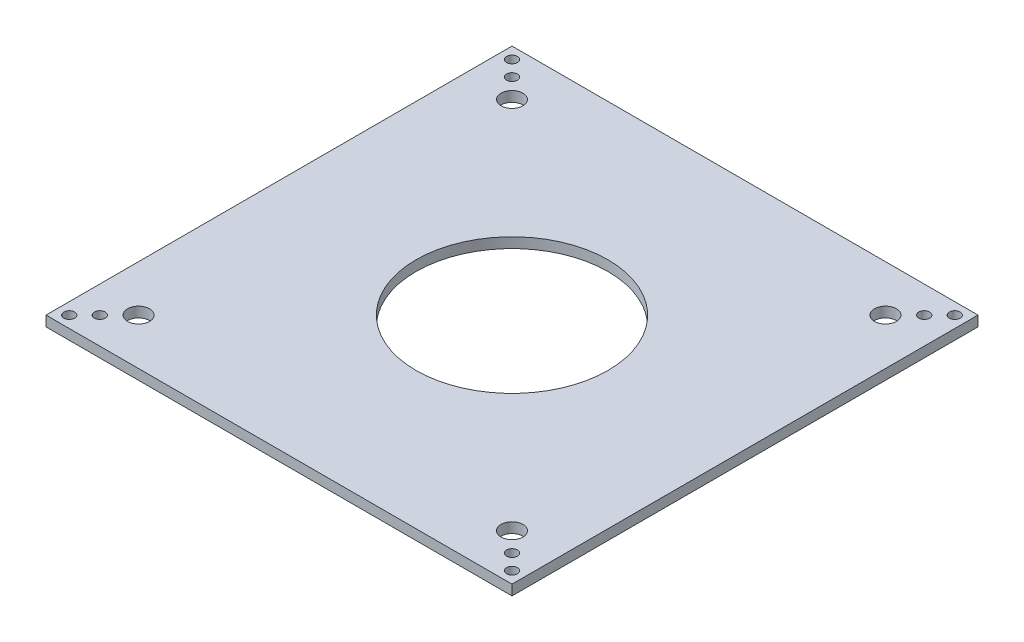
ISO-10303-21;
HEADER;
FILE_DESCRIPTION(('STEP AP214'),'2;1');
FILE_NAME('part.step','',(''),(''),'','','');
FILE_SCHEMA(('AUTOMOTIVE_DESIGN { 1 0 10303 214 1 1 1 1 }'));
ENDSEC;
DATA;
#1=APPLICATION_CONTEXT('core data for automotive mechanical design processes');
#2=APPLICATION_PROTOCOL_DEFINITION('international standard','automotive_design',2000,#1);
#3=PRODUCT_CONTEXT('',#1,'mechanical');
#4=PRODUCT('Part','Part','',(#3));
#5=PRODUCT_RELATED_PRODUCT_CATEGORY('part','',(#4));
#6=PRODUCT_DEFINITION_FORMATION('','',#4);
#7=PRODUCT_DEFINITION_CONTEXT('part definition',#1,'design');
#8=PRODUCT_DEFINITION('design','',#6,#7);
#9=PRODUCT_DEFINITION_SHAPE('','',#8);
#10=(LENGTH_UNIT() NAMED_UNIT(*) SI_UNIT(.MILLI.,.METRE.));
#11=(NAMED_UNIT(*) PLANE_ANGLE_UNIT() SI_UNIT($,.RADIAN.));
#12=(NAMED_UNIT(*) SI_UNIT($,.STERADIAN.) SOLID_ANGLE_UNIT());
#13=UNCERTAINTY_MEASURE_WITH_UNIT(LENGTH_MEASURE(1.E-05),#10,'distance_accuracy_value','');
#14=(GEOMETRIC_REPRESENTATION_CONTEXT(3) GLOBAL_UNCERTAINTY_ASSIGNED_CONTEXT((#13)) GLOBAL_UNIT_ASSIGNED_CONTEXT((#10,
#11,#12)) REPRESENTATION_CONTEXT('',''));
#15=CARTESIAN_POINT('',(0.,0.,0.));
#16=DIRECTION('',(0.,0.,1.));
#17=DIRECTION('',(1.,0.,0.));
#18=AXIS2_PLACEMENT_3D('',#15,#16,#17);
#19=CARTESIAN_POINT('',(0.,4.7498,0.));
#20=DIRECTION('',(0.,1.,0.));
#21=DIRECTION('',(0.,0.,1.));
#22=AXIS2_PLACEMENT_3D('',#19,#20,#21);
#23=PLANE('',#22);
#24=CARTESIAN_POINT('',(-86.5105223944239,4.7498,-86.5105223944239));
#25=DIRECTION('',(0.,1.,0.));
#26=DIRECTION('',(0.,0.,1.));
#27=AXIS2_PLACEMENT_3D('',#24,#25,#26);
#28=CIRCLE('',#27,5.08000000000002);
#29=CARTESIAN_POINT('',(-86.5105223944239,4.7498,-81.4305223944238));
#30=VERTEX_POINT('',#29);
#31=EDGE_CURVE('E179',#30,#30,#28,.T.);
#32=ORIENTED_EDGE('',*,*,#31,.F.);
#33=EDGE_LOOP('',(#32));
#34=FACE_BOUND('',#33,.T.);
#35=CARTESIAN_POINT('',(102.561846327358,4.7498,-102.561846327359));
#36=DIRECTION('',(0.,1.,0.));
#37=DIRECTION('',(0.,0.,1.));
#38=AXIS2_PLACEMENT_3D('',#35,#36,#37);
#39=CIRCLE('',#38,2.50000000000001);
#40=CARTESIAN_POINT('',(102.561846327358,4.7498,-100.061846327359));
#41=VERTEX_POINT('',#40);
#42=EDGE_CURVE('E167',#41,#41,#39,.T.);
#43=ORIENTED_EDGE('',*,*,#42,.F.);
#44=EDGE_LOOP('',(#43));
#45=FACE_BOUND('',#44,.T.);
#46=CARTESIAN_POINT('',(-102.561846327359,4.7498,-102.561846327358));
#47=DIRECTION('',(0.,1.,0.));
#48=DIRECTION('',(0.,0.,1.));
#49=AXIS2_PLACEMENT_3D('',#46,#47,#48);
#50=CIRCLE('',#49,2.5);
#51=CARTESIAN_POINT('',(-102.561846327359,4.7498,-100.061846327358));
#52=VERTEX_POINT('',#51);
#53=EDGE_CURVE('E155',#52,#52,#50,.T.);
#54=ORIENTED_EDGE('',*,*,#53,.F.);
#55=EDGE_LOOP('',(#54));
#56=FACE_BOUND('',#55,.T.);
#57=CARTESIAN_POINT('',(-102.561846327358,4.7498,102.561846327359));
#58=DIRECTION('',(0.,1.,0.));
#59=DIRECTION('',(0.,0.,1.));
#60=AXIS2_PLACEMENT_3D('',#57,#58,#59);
#61=CIRCLE('',#60,2.5);
#62=CARTESIAN_POINT('',(-102.561846327358,4.7498,105.061846327359));
#63=VERTEX_POINT('',#62);
#64=EDGE_CURVE('E143',#63,#63,#61,.T.);
#65=ORIENTED_EDGE('',*,*,#64,.F.);
#66=EDGE_LOOP('',(#65));
#67=FACE_BOUND('',#66,.T.);
#68=CARTESIAN_POINT('',(86.5105223944239,4.7498,86.5105223944239));
#69=DIRECTION('',(0.,1.,0.));
#70=DIRECTION('',(0.,0.,1.));
#71=AXIS2_PLACEMENT_3D('',#68,#69,#70);
#72=CIRCLE('',#71,5.08000000000001);
#73=CARTESIAN_POINT('',(86.5105223944239,4.7498,91.5905223944239));
#74=VERTEX_POINT('',#73);
#75=EDGE_CURVE('E131',#74,#74,#72,.T.);
#76=ORIENTED_EDGE('',*,*,#75,.F.);
#77=EDGE_LOOP('',(#76));
#78=FACE_BOUND('',#77,.T.);
#79=CARTESIAN_POINT('',(102.561846327359,4.7498,102.561846327358));
#80=DIRECTION('',(0.,1.,0.));
#81=DIRECTION('',(0.,0.,1.));
#82=AXIS2_PLACEMENT_3D('',#79,#80,#81);
#83=CIRCLE('',#82,2.50000000000001);
#84=CARTESIAN_POINT('',(102.561846327359,4.7498,105.061846327358));
#85=VERTEX_POINT('',#84);
#86=EDGE_CURVE('E119',#85,#85,#83,.T.);
#87=ORIENTED_EDGE('',*,*,#86,.F.);
#88=EDGE_LOOP('',(#87));
#89=FACE_BOUND('',#88,.T.);
#90=DIRECTION('',(0.,0.,1.));
#91=VECTOR('',#90,1.);
#92=CARTESIAN_POINT('',(-107.95,4.7498,-107.95));
#93=LINE('',#92,#91);
#94=CARTESIAN_POINT('',(-107.95,4.7498,-107.95));
#95=VERTEX_POINT('',#94);
#96=CARTESIAN_POINT('',(-107.95,4.7498,107.95));
#97=VERTEX_POINT('',#96);
#98=EDGE_CURVE('E89',#95,#97,#93,.T.);
#99=ORIENTED_EDGE('',*,*,#98,.T.);
#100=DIRECTION('',(1.,0.,0.));
#101=VECTOR('',#100,1.);
#102=CARTESIAN_POINT('',(-107.95,4.7498,107.95));
#103=LINE('',#102,#101);
#104=CARTESIAN_POINT('',(107.95,4.7498,107.95));
#105=VERTEX_POINT('',#104);
#106=EDGE_CURVE('E84',#97,#105,#103,.T.);
#107=ORIENTED_EDGE('',*,*,#106,.T.);
#108=DIRECTION('',(0.,0.,-1.));
#109=VECTOR('',#108,1.);
#110=CARTESIAN_POINT('',(107.95,4.7498,-107.95));
#111=LINE('',#110,#109);
#112=CARTESIAN_POINT('',(107.95,4.7498,-107.95));
#113=VERTEX_POINT('',#112);
#114=EDGE_CURVE('E87',#105,#113,#111,.T.);
#115=ORIENTED_EDGE('',*,*,#114,.T.);
#116=DIRECTION('',(-1.,0.,0.));
#117=VECTOR('',#116,1.);
#118=CARTESIAN_POINT('',(-107.95,4.7498,-107.95));
#119=LINE('',#118,#117);
#120=EDGE_CURVE('E54',#113,#95,#119,.T.);
#121=ORIENTED_EDGE('',*,*,#120,.T.);
#122=EDGE_LOOP('',(#99,#107,#115,#121));
#123=FACE_BOUND('',#122,.T.);
#124=CARTESIAN_POINT('',(95.490778515493,4.7498,95.490778515493));
#125=DIRECTION('',(0.,1.,0.));
#126=DIRECTION('',(0.,0.,1.));
#127=AXIS2_PLACEMENT_3D('',#124,#125,#126);
#128=CIRCLE('',#127,2.50000000000001);
#129=CARTESIAN_POINT('',(95.490778515493,4.7498,97.990778515493));
#130=VERTEX_POINT('',#129);
#131=EDGE_CURVE('E104',#130,#130,#128,.T.);
#132=ORIENTED_EDGE('',*,*,#131,.F.);
#133=EDGE_LOOP('',(#132));
#134=FACE_BOUND('',#133,.T.);
#135=CARTESIAN_POINT('',(0.,4.7498,0.));
#136=DIRECTION('',(0.,1.,0.));
#137=DIRECTION('',(0.,0.,1.));
#138=AXIS2_PLACEMENT_3D('',#135,#136,#137);
#139=CIRCLE('',#138,44.45);
#140=CARTESIAN_POINT('',(0.,4.7498,44.45));
#141=VERTEX_POINT('',#140);
#142=EDGE_CURVE('E125',#141,#141,#139,.T.);
#143=ORIENTED_EDGE('',*,*,#142,.F.);
#144=EDGE_LOOP('',(#143));
#145=FACE_BOUND('',#144,.T.);
#146=CARTESIAN_POINT('',(-95.490778515493,4.7498,95.490778515493));
#147=DIRECTION('',(0.,1.,0.));
#148=DIRECTION('',(0.,0.,1.));
#149=AXIS2_PLACEMENT_3D('',#146,#147,#148);
#150=CIRCLE('',#149,2.5);
#151=CARTESIAN_POINT('',(-95.490778515493,4.7498,97.990778515493));
#152=VERTEX_POINT('',#151);
#153=EDGE_CURVE('E137',#152,#152,#150,.T.);
#154=ORIENTED_EDGE('',*,*,#153,.F.);
#155=EDGE_LOOP('',(#154));
#156=FACE_BOUND('',#155,.T.);
#157=CARTESIAN_POINT('',(-95.4907785154931,4.7498,-95.490778515493));
#158=DIRECTION('',(0.,1.,0.));
#159=DIRECTION('',(0.,0.,1.));
#160=AXIS2_PLACEMENT_3D('',#157,#158,#159);
#161=CIRCLE('',#160,2.5);
#162=CARTESIAN_POINT('',(-95.4907785154931,4.7498,-92.990778515493));
#163=VERTEX_POINT('',#162);
#164=EDGE_CURVE('E149',#163,#163,#161,.T.);
#165=ORIENTED_EDGE('',*,*,#164,.F.);
#166=EDGE_LOOP('',(#165));
#167=FACE_BOUND('',#166,.T.);
#168=CARTESIAN_POINT('',(95.490778515493,4.7498,-95.490778515493));
#169=DIRECTION('',(0.,1.,0.));
#170=DIRECTION('',(0.,0.,1.));
#171=AXIS2_PLACEMENT_3D('',#168,#169,#170);
#172=CIRCLE('',#171,2.50000000000001);
#173=CARTESIAN_POINT('',(95.490778515493,4.7498,-92.990778515493));
#174=VERTEX_POINT('',#173);
#175=EDGE_CURVE('E161',#174,#174,#172,.T.);
#176=ORIENTED_EDGE('',*,*,#175,.F.);
#177=EDGE_LOOP('',(#176));
#178=FACE_BOUND('',#177,.T.);
#179=CARTESIAN_POINT('',(-86.5105223944239,4.7498,86.5105223944239));
#180=DIRECTION('',(0.,1.,0.));
#181=DIRECTION('',(0.,0.,1.));
#182=AXIS2_PLACEMENT_3D('',#179,#180,#181);
#183=CIRCLE('',#182,5.08000000000002);
#184=CARTESIAN_POINT('',(-86.5105223944239,4.7498,91.5905223944239));
#185=VERTEX_POINT('',#184);
#186=EDGE_CURVE('E173',#185,#185,#183,.T.);
#187=ORIENTED_EDGE('',*,*,#186,.F.);
#188=EDGE_LOOP('',(#187));
#189=FACE_BOUND('',#188,.T.);
#190=CARTESIAN_POINT('',(86.5105223944239,4.7498,-86.5105223944239));
#191=DIRECTION('',(0.,1.,0.));
#192=DIRECTION('',(0.,0.,1.));
#193=AXIS2_PLACEMENT_3D('',#190,#191,#192);
#194=CIRCLE('',#193,5.08000000000001);
#195=CARTESIAN_POINT('',(86.5105223944239,4.7498,-81.4305223944239));
#196=VERTEX_POINT('',#195);
#197=EDGE_CURVE('E185',#196,#196,#194,.T.);
#198=ORIENTED_EDGE('',*,*,#197,.F.);
#199=EDGE_LOOP('',(#198));
#200=FACE_BOUND('',#199,.T.);
#201=ADVANCED_FACE('F37',(#34,#45,#56,#67,#78,#89,#123,#134,#145,#156,#167,#178,#189,#200),#23,.T.);
#202=CARTESIAN_POINT('',(0.,0.,0.));
#203=DIRECTION('',(0.,1.,0.));
#204=DIRECTION('',(0.,0.,1.));
#205=AXIS2_PLACEMENT_3D('',#202,#203,#204);
#206=PLANE('',#205);
#207=DIRECTION('',(0.,0.,1.));
#208=VECTOR('',#207,1.);
#209=CARTESIAN_POINT('',(-107.95,0.,-107.95));
#210=LINE('',#209,#208);
#211=CARTESIAN_POINT('',(-107.95,0.,-107.95));
#212=VERTEX_POINT('',#211);
#213=CARTESIAN_POINT('',(-107.95,0.,107.95));
#214=VERTEX_POINT('',#213);
#215=EDGE_CURVE('E101',#212,#214,#210,.T.);
#216=ORIENTED_EDGE('',*,*,#215,.F.);
#217=DIRECTION('',(-1.,0.,0.));
#218=VECTOR('',#217,1.);
#219=CARTESIAN_POINT('',(-107.95,0.,-107.95));
#220=LINE('',#219,#218);
#221=CARTESIAN_POINT('',(107.95,0.,-107.95));
#222=VERTEX_POINT('',#221);
#223=EDGE_CURVE('E77',#222,#212,#220,.T.);
#224=ORIENTED_EDGE('',*,*,#223,.F.);
#225=DIRECTION('',(0.,0.,-1.));
#226=VECTOR('',#225,1.);
#227=CARTESIAN_POINT('',(107.95,0.,-107.95));
#228=LINE('',#227,#226);
#229=CARTESIAN_POINT('',(107.95,0.,107.95));
#230=VERTEX_POINT('',#229);
#231=EDGE_CURVE('E71',#230,#222,#228,.T.);
#232=ORIENTED_EDGE('',*,*,#231,.F.);
#233=DIRECTION('',(1.,0.,0.));
#234=VECTOR('',#233,1.);
#235=CARTESIAN_POINT('',(-107.95,0.,107.95));
#236=LINE('',#235,#234);
#237=EDGE_CURVE('E93',#214,#230,#236,.T.);
#238=ORIENTED_EDGE('',*,*,#237,.F.);
#239=EDGE_LOOP('',(#216,#224,#232,#238));
#240=FACE_BOUND('',#239,.T.);
#241=CARTESIAN_POINT('',(95.490778515493,0.,95.490778515493));
#242=DIRECTION('',(0.,1.,0.));
#243=DIRECTION('',(0.,0.,1.));
#244=AXIS2_PLACEMENT_3D('',#241,#242,#243);
#245=CIRCLE('',#244,2.50000000000001);
#246=CARTESIAN_POINT('',(95.490778515493,0.,97.990778515493));
#247=VERTEX_POINT('',#246);
#248=EDGE_CURVE('E116',#247,#247,#245,.T.);
#249=ORIENTED_EDGE('',*,*,#248,.T.);
#250=EDGE_LOOP('',(#249));
#251=FACE_BOUND('',#250,.T.);
#252=CARTESIAN_POINT('',(102.561846327359,0.,102.561846327358));
#253=DIRECTION('',(0.,1.,0.));
#254=DIRECTION('',(0.,0.,1.));
#255=AXIS2_PLACEMENT_3D('',#252,#253,#254);
#256=CIRCLE('',#255,2.50000000000001);
#257=CARTESIAN_POINT('',(102.561846327359,0.,105.061846327358));
#258=VERTEX_POINT('',#257);
#259=EDGE_CURVE('E122',#258,#258,#256,.T.);
#260=ORIENTED_EDGE('',*,*,#259,.T.);
#261=EDGE_LOOP('',(#260));
#262=FACE_BOUND('',#261,.T.);
#263=CARTESIAN_POINT('',(0.,0.,0.));
#264=DIRECTION('',(0.,1.,0.));
#265=DIRECTION('',(0.,0.,1.));
#266=AXIS2_PLACEMENT_3D('',#263,#264,#265);
#267=CIRCLE('',#266,44.45);
#268=CARTESIAN_POINT('',(0.,0.,44.45));
#269=VERTEX_POINT('',#268);
#270=EDGE_CURVE('E128',#269,#269,#267,.T.);
#271=ORIENTED_EDGE('',*,*,#270,.T.);
#272=EDGE_LOOP('',(#271));
#273=FACE_BOUND('',#272,.T.);
#274=CARTESIAN_POINT('',(86.5105223944239,0.,86.5105223944239));
#275=DIRECTION('',(0.,1.,0.));
#276=DIRECTION('',(0.,0.,1.));
#277=AXIS2_PLACEMENT_3D('',#274,#275,#276);
#278=CIRCLE('',#277,5.08000000000001);
#279=CARTESIAN_POINT('',(86.5105223944239,0.,91.5905223944239));
#280=VERTEX_POINT('',#279);
#281=EDGE_CURVE('E134',#280,#280,#278,.T.);
#282=ORIENTED_EDGE('',*,*,#281,.T.);
#283=EDGE_LOOP('',(#282));
#284=FACE_BOUND('',#283,.T.);
#285=CARTESIAN_POINT('',(-95.490778515493,0.,95.490778515493));
#286=DIRECTION('',(0.,1.,0.));
#287=DIRECTION('',(0.,0.,1.));
#288=AXIS2_PLACEMENT_3D('',#285,#286,#287);
#289=CIRCLE('',#288,2.5);
#290=CARTESIAN_POINT('',(-95.490778515493,0.,97.990778515493));
#291=VERTEX_POINT('',#290);
#292=EDGE_CURVE('E140',#291,#291,#289,.T.);
#293=ORIENTED_EDGE('',*,*,#292,.T.);
#294=EDGE_LOOP('',(#293));
#295=FACE_BOUND('',#294,.T.);
#296=CARTESIAN_POINT('',(-102.561846327358,0.,102.561846327359));
#297=DIRECTION('',(0.,1.,0.));
#298=DIRECTION('',(0.,0.,1.));
#299=AXIS2_PLACEMENT_3D('',#296,#297,#298);
#300=CIRCLE('',#299,2.5);
#301=CARTESIAN_POINT('',(-102.561846327358,0.,105.061846327359));
#302=VERTEX_POINT('',#301);
#303=EDGE_CURVE('E146',#302,#302,#300,.T.);
#304=ORIENTED_EDGE('',*,*,#303,.T.);
#305=EDGE_LOOP('',(#304));
#306=FACE_BOUND('',#305,.T.);
#307=CARTESIAN_POINT('',(-95.4907785154931,0.,-95.490778515493));
#308=DIRECTION('',(0.,1.,0.));
#309=DIRECTION('',(0.,0.,1.));
#310=AXIS2_PLACEMENT_3D('',#307,#308,#309);
#311=CIRCLE('',#310,2.5);
#312=CARTESIAN_POINT('',(-95.4907785154931,0.,-92.990778515493));
#313=VERTEX_POINT('',#312);
#314=EDGE_CURVE('E152',#313,#313,#311,.T.);
#315=ORIENTED_EDGE('',*,*,#314,.T.);
#316=EDGE_LOOP('',(#315));
#317=FACE_BOUND('',#316,.T.);
#318=CARTESIAN_POINT('',(-102.561846327359,0.,-102.561846327358));
#319=DIRECTION('',(0.,1.,0.));
#320=DIRECTION('',(0.,0.,1.));
#321=AXIS2_PLACEMENT_3D('',#318,#319,#320);
#322=CIRCLE('',#321,2.5);
#323=CARTESIAN_POINT('',(-102.561846327359,0.,-100.061846327358));
#324=VERTEX_POINT('',#323);
#325=EDGE_CURVE('E158',#324,#324,#322,.T.);
#326=ORIENTED_EDGE('',*,*,#325,.T.);
#327=EDGE_LOOP('',(#326));
#328=FACE_BOUND('',#327,.T.);
#329=CARTESIAN_POINT('',(95.490778515493,0.,-95.490778515493));
#330=DIRECTION('',(0.,1.,0.));
#331=DIRECTION('',(0.,0.,1.));
#332=AXIS2_PLACEMENT_3D('',#329,#330,#331);
#333=CIRCLE('',#332,2.50000000000001);
#334=CARTESIAN_POINT('',(95.490778515493,0.,-92.990778515493));
#335=VERTEX_POINT('',#334);
#336=EDGE_CURVE('E164',#335,#335,#333,.T.);
#337=ORIENTED_EDGE('',*,*,#336,.T.);
#338=EDGE_LOOP('',(#337));
#339=FACE_BOUND('',#338,.T.);
#340=CARTESIAN_POINT('',(102.561846327358,0.,-102.561846327359));
#341=DIRECTION('',(0.,1.,0.));
#342=DIRECTION('',(0.,0.,1.));
#343=AXIS2_PLACEMENT_3D('',#340,#341,#342);
#344=CIRCLE('',#343,2.50000000000001);
#345=CARTESIAN_POINT('',(102.561846327358,0.,-100.061846327359));
#346=VERTEX_POINT('',#345);
#347=EDGE_CURVE('E170',#346,#346,#344,.T.);
#348=ORIENTED_EDGE('',*,*,#347,.T.);
#349=EDGE_LOOP('',(#348));
#350=FACE_BOUND('',#349,.T.);
#351=CARTESIAN_POINT('',(-86.5105223944239,0.,86.5105223944239));
#352=DIRECTION('',(0.,1.,0.));
#353=DIRECTION('',(0.,0.,1.));
#354=AXIS2_PLACEMENT_3D('',#351,#352,#353);
#355=CIRCLE('',#354,5.08000000000002);
#356=CARTESIAN_POINT('',(-86.5105223944239,0.,91.5905223944239));
#357=VERTEX_POINT('',#356);
#358=EDGE_CURVE('E176',#357,#357,#355,.T.);
#359=ORIENTED_EDGE('',*,*,#358,.T.);
#360=EDGE_LOOP('',(#359));
#361=FACE_BOUND('',#360,.T.);
#362=CARTESIAN_POINT('',(-86.5105223944239,0.,-86.5105223944239));
#363=DIRECTION('',(0.,1.,0.));
#364=DIRECTION('',(0.,0.,1.));
#365=AXIS2_PLACEMENT_3D('',#362,#363,#364);
#366=CIRCLE('',#365,5.08000000000002);
#367=CARTESIAN_POINT('',(-86.5105223944239,0.,-81.4305223944238));
#368=VERTEX_POINT('',#367);
#369=EDGE_CURVE('E182',#368,#368,#366,.T.);
#370=ORIENTED_EDGE('',*,*,#369,.T.);
#371=EDGE_LOOP('',(#370));
#372=FACE_BOUND('',#371,.T.);
#373=CARTESIAN_POINT('',(86.5105223944239,0.,-86.5105223944239));
#374=DIRECTION('',(0.,1.,0.));
#375=DIRECTION('',(0.,0.,1.));
#376=AXIS2_PLACEMENT_3D('',#373,#374,#375);
#377=CIRCLE('',#376,5.08000000000001);
#378=CARTESIAN_POINT('',(86.5105223944239,0.,-81.4305223944239));
#379=VERTEX_POINT('',#378);
#380=EDGE_CURVE('E188',#379,#379,#377,.T.);
#381=ORIENTED_EDGE('',*,*,#380,.T.);
#382=EDGE_LOOP('',(#381));
#383=FACE_BOUND('',#382,.T.);
#384=ADVANCED_FACE('F112',(#240,#251,#262,#273,#284,#295,#306,#317,#328,#339,#350,#361,#372,
#383),#206,.F.);
#385=CARTESIAN_POINT('',(-107.95,4.7498,-107.95));
#386=DIRECTION('',(1.,0.,0.));
#387=DIRECTION('',(0.,0.,-1.));
#388=AXIS2_PLACEMENT_3D('',#385,#386,#387);
#389=PLANE('',#388);
#390=ORIENTED_EDGE('',*,*,#215,.T.);
#391=DIRECTION('',(0.,-1.,0.));
#392=VECTOR('',#391,1.);
#393=CARTESIAN_POINT('',(-107.95,4.7498,107.95));
#394=LINE('',#393,#392);
#395=EDGE_CURVE('E11',#97,#214,#394,.T.);
#396=ORIENTED_EDGE('',*,*,#395,.F.);
#397=ORIENTED_EDGE('',*,*,#98,.F.);
#398=DIRECTION('',(0.,-1.,0.));
#399=VECTOR('',#398,1.);
#400=CARTESIAN_POINT('',(-107.95,4.7498,-107.95));
#401=LINE('',#400,#399);
#402=EDGE_CURVE('E97',#95,#212,#401,.T.);
#403=ORIENTED_EDGE('',*,*,#402,.T.);
#404=EDGE_LOOP('',(#390,#396,#397,#403));
#405=FACE_BOUND('',#404,.T.);
#406=ADVANCED_FACE('F39',(#405),#389,.F.);
#407=CARTESIAN_POINT('',(-107.95,4.7498,107.95));
#408=DIRECTION('',(0.,0.,-1.));
#409=DIRECTION('',(-1.,0.,0.));
#410=AXIS2_PLACEMENT_3D('',#407,#408,#409);
#411=PLANE('',#410);
#412=ORIENTED_EDGE('',*,*,#237,.T.);
#413=DIRECTION('',(0.,-1.,0.));
#414=VECTOR('',#413,1.);
#415=CARTESIAN_POINT('',(107.95,4.7498,107.95));
#416=LINE('',#415,#414);
#417=EDGE_CURVE('E46',#105,#230,#416,.T.);
#418=ORIENTED_EDGE('',*,*,#417,.F.);
#419=ORIENTED_EDGE('',*,*,#106,.F.);
#420=ORIENTED_EDGE('',*,*,#395,.T.);
#421=EDGE_LOOP('',(#412,#418,#419,#420));
#422=FACE_BOUND('',#421,.T.);
#423=ADVANCED_FACE('F92',(#422),#411,.F.);
#424=CARTESIAN_POINT('',(107.95,4.7498,-107.95));
#425=DIRECTION('',(-1.,0.,0.));
#426=DIRECTION('',(0.,0.,1.));
#427=AXIS2_PLACEMENT_3D('',#424,#425,#426);
#428=PLANE('',#427);
#429=ORIENTED_EDGE('',*,*,#231,.T.);
#430=DIRECTION('',(0.,-1.,0.));
#431=VECTOR('',#430,1.);
#432=CARTESIAN_POINT('',(107.95,4.7498,-107.95));
#433=LINE('',#432,#431);
#434=EDGE_CURVE('E94',#113,#222,#433,.T.);
#435=ORIENTED_EDGE('',*,*,#434,.F.);
#436=ORIENTED_EDGE('',*,*,#114,.F.);
#437=ORIENTED_EDGE('',*,*,#417,.T.);
#438=EDGE_LOOP('',(#429,#435,#436,#437));
#439=FACE_BOUND('',#438,.T.);
#440=ADVANCED_FACE('F95',(#439),#428,.F.);
#441=CARTESIAN_POINT('',(-107.95,4.7498,-107.95));
#442=DIRECTION('',(0.,0.,1.));
#443=DIRECTION('',(1.,0.,0.));
#444=AXIS2_PLACEMENT_3D('',#441,#442,#443);
#445=PLANE('',#444);
#446=ORIENTED_EDGE('',*,*,#223,.T.);
#447=ORIENTED_EDGE('',*,*,#402,.F.);
#448=ORIENTED_EDGE('',*,*,#120,.F.);
#449=ORIENTED_EDGE('',*,*,#434,.T.);
#450=EDGE_LOOP('',(#446,#447,#448,#449));
#451=FACE_BOUND('',#450,.T.);
#452=ADVANCED_FACE('F109',(#451),#445,.F.);
#453=CARTESIAN_POINT('',(95.490778515493,4.7498,95.490778515493));
#454=DIRECTION('',(0.,-1.,0.));
#455=DIRECTION('',(0.,0.,-1.));
#456=AXIS2_PLACEMENT_3D('',#453,#454,#455);
#457=CYLINDRICAL_SURFACE('',#456,2.50000000000001);
#458=ORIENTED_EDGE('',*,*,#131,.T.);
#459=EDGE_LOOP('',(#458));
#460=FACE_BOUND('',#459,.T.);
#461=ORIENTED_EDGE('',*,*,#248,.F.);
#462=EDGE_LOOP('',(#461));
#463=FACE_BOUND('',#462,.T.);
#464=ADVANCED_FACE('F207',(#460,#463),#457,.F.);
#465=CARTESIAN_POINT('',(102.561846327359,4.7498,102.561846327358));
#466=DIRECTION('',(0.,-1.,0.));
#467=DIRECTION('',(0.,0.,-1.));
#468=AXIS2_PLACEMENT_3D('',#465,#466,#467);
#469=CYLINDRICAL_SURFACE('',#468,2.50000000000001);
#470=ORIENTED_EDGE('',*,*,#86,.T.);
#471=EDGE_LOOP('',(#470));
#472=FACE_BOUND('',#471,.T.);
#473=ORIENTED_EDGE('',*,*,#259,.F.);
#474=EDGE_LOOP('',(#473));
#475=FACE_BOUND('',#474,.T.);
#476=ADVANCED_FACE('F261',(#472,#475),#469,.F.);
#477=CARTESIAN_POINT('',(0.,4.7498,0.));
#478=DIRECTION('',(0.,-1.,0.));
#479=DIRECTION('',(0.,0.,-1.));
#480=AXIS2_PLACEMENT_3D('',#477,#478,#479);
#481=CYLINDRICAL_SURFACE('',#480,44.45);
#482=ORIENTED_EDGE('',*,*,#142,.T.);
#483=EDGE_LOOP('',(#482));
#484=FACE_BOUND('',#483,.T.);
#485=ORIENTED_EDGE('',*,*,#270,.F.);
#486=EDGE_LOOP('',(#485));
#487=FACE_BOUND('',#486,.T.);
#488=ADVANCED_FACE('F270',(#484,#487),#481,.F.);
#489=CARTESIAN_POINT('',(86.5105223944239,4.7498,86.5105223944239));
#490=DIRECTION('',(0.,-1.,0.));
#491=DIRECTION('',(0.,0.,-1.));
#492=AXIS2_PLACEMENT_3D('',#489,#490,#491);
#493=CYLINDRICAL_SURFACE('',#492,5.08000000000001);
#494=ORIENTED_EDGE('',*,*,#75,.T.);
#495=EDGE_LOOP('',(#494));
#496=FACE_BOUND('',#495,.T.);
#497=ORIENTED_EDGE('',*,*,#281,.F.);
#498=EDGE_LOOP('',(#497));
#499=FACE_BOUND('',#498,.T.);
#500=ADVANCED_FACE('F279',(#496,#499),#493,.F.);
#501=CARTESIAN_POINT('',(-95.490778515493,4.7498,95.490778515493));
#502=DIRECTION('',(0.,-1.,0.));
#503=DIRECTION('',(0.,0.,-1.));
#504=AXIS2_PLACEMENT_3D('',#501,#502,#503);
#505=CYLINDRICAL_SURFACE('',#504,2.5);
#506=ORIENTED_EDGE('',*,*,#153,.T.);
#507=EDGE_LOOP('',(#506));
#508=FACE_BOUND('',#507,.T.);
#509=ORIENTED_EDGE('',*,*,#292,.F.);
#510=EDGE_LOOP('',(#509));
#511=FACE_BOUND('',#510,.T.);
#512=ADVANCED_FACE('F289',(#508,#511),#505,.F.);
#513=CARTESIAN_POINT('',(-102.561846327358,4.7498,102.561846327359));
#514=DIRECTION('',(0.,-1.,0.));
#515=DIRECTION('',(0.,0.,-1.));
#516=AXIS2_PLACEMENT_3D('',#513,#514,#515);
#517=CYLINDRICAL_SURFACE('',#516,2.5);
#518=ORIENTED_EDGE('',*,*,#64,.T.);
#519=EDGE_LOOP('',(#518));
#520=FACE_BOUND('',#519,.T.);
#521=ORIENTED_EDGE('',*,*,#303,.F.);
#522=EDGE_LOOP('',(#521));
#523=FACE_BOUND('',#522,.T.);
#524=ADVANCED_FACE('F299',(#520,#523),#517,.F.);
#525=CARTESIAN_POINT('',(-95.4907785154931,4.7498,-95.490778515493));
#526=DIRECTION('',(0.,-1.,0.));
#527=DIRECTION('',(0.,0.,-1.));
#528=AXIS2_PLACEMENT_3D('',#525,#526,#527);
#529=CYLINDRICAL_SURFACE('',#528,2.5);
#530=ORIENTED_EDGE('',*,*,#164,.T.);
#531=EDGE_LOOP('',(#530));
#532=FACE_BOUND('',#531,.T.);
#533=ORIENTED_EDGE('',*,*,#314,.F.);
#534=EDGE_LOOP('',(#533));
#535=FACE_BOUND('',#534,.T.);
#536=ADVANCED_FACE('F309',(#532,#535),#529,.F.);
#537=CARTESIAN_POINT('',(-102.561846327359,4.7498,-102.561846327358));
#538=DIRECTION('',(0.,-1.,0.));
#539=DIRECTION('',(0.,0.,-1.));
#540=AXIS2_PLACEMENT_3D('',#537,#538,#539);
#541=CYLINDRICAL_SURFACE('',#540,2.5);
#542=ORIENTED_EDGE('',*,*,#53,.T.);
#543=EDGE_LOOP('',(#542));
#544=FACE_BOUND('',#543,.T.);
#545=ORIENTED_EDGE('',*,*,#325,.F.);
#546=EDGE_LOOP('',(#545));
#547=FACE_BOUND('',#546,.T.);
#548=ADVANCED_FACE('F319',(#544,#547),#541,.F.);
#549=CARTESIAN_POINT('',(95.490778515493,4.7498,-95.490778515493));
#550=DIRECTION('',(0.,-1.,0.));
#551=DIRECTION('',(0.,0.,-1.));
#552=AXIS2_PLACEMENT_3D('',#549,#550,#551);
#553=CYLINDRICAL_SURFACE('',#552,2.50000000000001);
#554=ORIENTED_EDGE('',*,*,#175,.T.);
#555=EDGE_LOOP('',(#554));
#556=FACE_BOUND('',#555,.T.);
#557=ORIENTED_EDGE('',*,*,#336,.F.);
#558=EDGE_LOOP('',(#557));
#559=FACE_BOUND('',#558,.T.);
#560=ADVANCED_FACE('F329',(#556,#559),#553,.F.);
#561=CARTESIAN_POINT('',(102.561846327358,4.7498,-102.561846327359));
#562=DIRECTION('',(0.,-1.,0.));
#563=DIRECTION('',(0.,0.,-1.));
#564=AXIS2_PLACEMENT_3D('',#561,#562,#563);
#565=CYLINDRICAL_SURFACE('',#564,2.50000000000001);
#566=ORIENTED_EDGE('',*,*,#42,.T.);
#567=EDGE_LOOP('',(#566));
#568=FACE_BOUND('',#567,.T.);
#569=ORIENTED_EDGE('',*,*,#347,.F.);
#570=EDGE_LOOP('',(#569));
#571=FACE_BOUND('',#570,.T.);
#572=ADVANCED_FACE('F339',(#568,#571),#565,.F.);
#573=CARTESIAN_POINT('',(-86.5105223944239,4.7498,86.5105223944239));
#574=DIRECTION('',(0.,-1.,0.));
#575=DIRECTION('',(0.,0.,-1.));
#576=AXIS2_PLACEMENT_3D('',#573,#574,#575);
#577=CYLINDRICAL_SURFACE('',#576,5.08000000000002);
#578=ORIENTED_EDGE('',*,*,#186,.T.);
#579=EDGE_LOOP('',(#578));
#580=FACE_BOUND('',#579,.T.);
#581=ORIENTED_EDGE('',*,*,#358,.F.);
#582=EDGE_LOOP('',(#581));
#583=FACE_BOUND('',#582,.T.);
#584=ADVANCED_FACE('F349',(#580,#583),#577,.F.);
#585=CARTESIAN_POINT('',(-86.5105223944239,4.7498,-86.5105223944239));
#586=DIRECTION('',(0.,-1.,0.));
#587=DIRECTION('',(0.,0.,-1.));
#588=AXIS2_PLACEMENT_3D('',#585,#586,#587);
#589=CYLINDRICAL_SURFACE('',#588,5.08000000000002);
#590=ORIENTED_EDGE('',*,*,#31,.T.);
#591=EDGE_LOOP('',(#590));
#592=FACE_BOUND('',#591,.T.);
#593=ORIENTED_EDGE('',*,*,#369,.F.);
#594=EDGE_LOOP('',(#593));
#595=FACE_BOUND('',#594,.T.);
#596=ADVANCED_FACE('F359',(#592,#595),#589,.F.);
#597=CARTESIAN_POINT('',(86.5105223944239,4.7498,-86.5105223944239));
#598=DIRECTION('',(0.,-1.,0.));
#599=DIRECTION('',(0.,0.,-1.));
#600=AXIS2_PLACEMENT_3D('',#597,#598,#599);
#601=CYLINDRICAL_SURFACE('',#600,5.08000000000001);
#602=ORIENTED_EDGE('',*,*,#197,.T.);
#603=EDGE_LOOP('',(#602));
#604=FACE_BOUND('',#603,.T.);
#605=ORIENTED_EDGE('',*,*,#380,.F.);
#606=EDGE_LOOP('',(#605));
#607=FACE_BOUND('',#606,.T.);
#608=ADVANCED_FACE('F194',(#604,#607),#601,.F.);
#609=CLOSED_SHELL('',(#201,#384,#406,#423,#440,#452,#464,#476,#488,#500,#512,#524,#536,#548,
#560,#572,#584,#596,#608));
#610=MANIFOLD_SOLID_BREP('B2',#609);
#611=ADVANCED_BREP_SHAPE_REPRESENTATION('',(#18,#610),#14);
#612=SHAPE_DEFINITION_REPRESENTATION(#9,#611);
ENDSEC;
END-ISO-10303-21;
